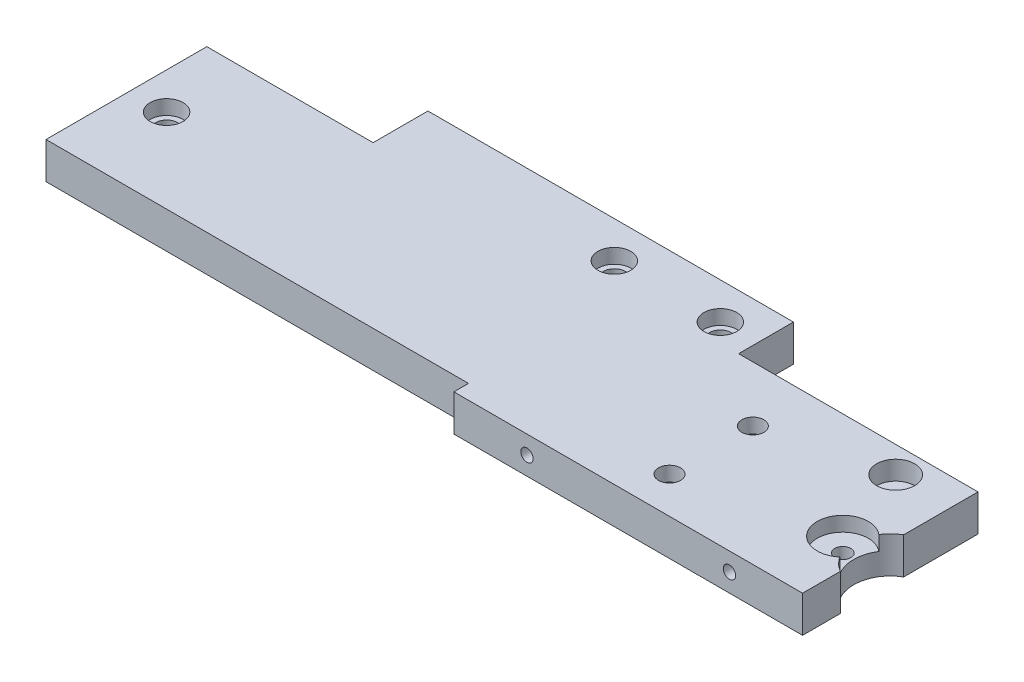
ISO-10303-21;
HEADER;
FILE_DESCRIPTION(('STEP AP214'),'2;1');
FILE_NAME('part.step','',(''),(''),'','','');
FILE_SCHEMA(('AUTOMOTIVE_DESIGN { 1 0 10303 214 1 1 1 1 }'));
ENDSEC;
DATA;
#1=APPLICATION_CONTEXT('core data for automotive mechanical design processes');
#2=APPLICATION_PROTOCOL_DEFINITION('international standard','automotive_design',2000,#1);
#3=PRODUCT_CONTEXT('',#1,'mechanical');
#4=PRODUCT('Part','Part','',(#3));
#5=PRODUCT_RELATED_PRODUCT_CATEGORY('part','',(#4));
#6=PRODUCT_DEFINITION_FORMATION('','',#4);
#7=PRODUCT_DEFINITION_CONTEXT('part definition',#1,'design');
#8=PRODUCT_DEFINITION('design','',#6,#7);
#9=PRODUCT_DEFINITION_SHAPE('','',#8);
#10=(LENGTH_UNIT() NAMED_UNIT(*) SI_UNIT(.MILLI.,.METRE.));
#11=(NAMED_UNIT(*) PLANE_ANGLE_UNIT() SI_UNIT($,.RADIAN.));
#12=(NAMED_UNIT(*) SI_UNIT($,.STERADIAN.) SOLID_ANGLE_UNIT());
#13=UNCERTAINTY_MEASURE_WITH_UNIT(LENGTH_MEASURE(1.E-05),#10,'distance_accuracy_value','');
#14=(GEOMETRIC_REPRESENTATION_CONTEXT(3) GLOBAL_UNCERTAINTY_ASSIGNED_CONTEXT((#13)) GLOBAL_UNIT_ASSIGNED_CONTEXT((#10,
#11,#12)) REPRESENTATION_CONTEXT('',''));
#15=CARTESIAN_POINT('',(0.,0.,0.));
#16=DIRECTION('',(0.,0.,1.));
#17=DIRECTION('',(1.,0.,0.));
#18=AXIS2_PLACEMENT_3D('',#15,#16,#17);
#19=CARTESIAN_POINT('',(28.75,0.,22.));
#20=DIRECTION('',(0.,1.,0.));
#21=DIRECTION('',(0.,0.,1.));
#22=AXIS2_PLACEMENT_3D('',#19,#20,#21);
#23=CYLINDRICAL_SURFACE('',#22,1.1);
#24=CARTESIAN_POINT('',(28.75,0.,22.));
#25=DIRECTION('',(0.,1.,0.));
#26=DIRECTION('',(0.,0.,1.));
#27=AXIS2_PLACEMENT_3D('',#24,#25,#26);
#28=CIRCLE('',#27,1.1);
#29=CARTESIAN_POINT('',(28.75,0.,23.1));
#30=VERTEX_POINT('',#29);
#31=EDGE_CURVE('E280',#30,#30,#28,.T.);
#32=ORIENTED_EDGE('',*,*,#31,.F.);
#33=EDGE_LOOP('',(#32));
#34=FACE_BOUND('',#33,.T.);
#35=CARTESIAN_POINT('',(28.75,3.,22.));
#36=DIRECTION('',(0.,1.,0.));
#37=DIRECTION('',(0.,0.,1.));
#38=AXIS2_PLACEMENT_3D('',#35,#36,#37);
#39=CIRCLE('',#38,1.1);
#40=CARTESIAN_POINT('',(28.75,3.,23.1));
#41=VERTEX_POINT('',#40);
#42=EDGE_CURVE('E230',#41,#41,#39,.F.);
#43=ORIENTED_EDGE('',*,*,#42,.F.);
#44=EDGE_LOOP('',(#43));
#45=FACE_BOUND('',#44,.T.);
#46=ADVANCED_FACE('F109',(#34,#45),#23,.F.);
#47=CARTESIAN_POINT('',(32.75,5.,7.5));
#48=DIRECTION('',(1.,0.,0.));
#49=DIRECTION('',(0.,0.,-1.));
#50=AXIS2_PLACEMENT_3D('',#47,#48,#49);
#51=PLANE('',#50);
#52=DIRECTION('',(0.,0.,1.));
#53=VECTOR('',#52,1.);
#54=CARTESIAN_POINT('',(32.75,0.,7.5));
#55=LINE('',#54,#53);
#56=CARTESIAN_POINT('',(32.75,0.,26.3301270189222));
#57=VERTEX_POINT('',#56);
#58=CARTESIAN_POINT('',(32.75,0.,31.5));
#59=VERTEX_POINT('',#58);
#60=EDGE_CURVE('E326',#57,#59,#55,.T.);
#61=ORIENTED_EDGE('',*,*,#60,.F.);
#62=DIRECTION('',(0.,-1.,0.));
#63=VECTOR('',#62,1.);
#64=CARTESIAN_POINT('',(32.75,5.,26.3301270189222));
#65=LINE('',#64,#63);
#66=CARTESIAN_POINT('',(32.75,5.,26.3301270189222));
#67=VERTEX_POINT('',#66);
#68=EDGE_CURVE('E401',#57,#67,#65,.F.);
#69=ORIENTED_EDGE('',*,*,#68,.T.);
#70=DIRECTION('',(0.,0.,1.));
#71=VECTOR('',#70,1.);
#72=CARTESIAN_POINT('',(32.75,5.,7.5));
#73=LINE('',#72,#71);
#74=CARTESIAN_POINT('',(32.75,5.,31.5));
#75=VERTEX_POINT('',#74);
#76=EDGE_CURVE('E226',#67,#75,#73,.T.);
#77=ORIENTED_EDGE('',*,*,#76,.T.);
#78=DIRECTION('',(0.,1.,0.));
#79=VECTOR('',#78,1.);
#80=CARTESIAN_POINT('',(32.75,5.,31.5));
#81=LINE('',#80,#79);
#82=EDGE_CURVE('E246',#59,#75,#81,.T.);
#83=ORIENTED_EDGE('',*,*,#82,.F.);
#84=EDGE_LOOP('',(#61,#69,#77,#83));
#85=FACE_BOUND('',#84,.T.);
#86=ADVANCED_FACE('F111',(#85),#51,.T.);
#87=CARTESIAN_POINT('',(32.75,5.,7.5));
#88=VERTEX_POINT('',#87);
#89=CARTESIAN_POINT('',(32.75,5.,17.6698729810778));
#90=VERTEX_POINT('',#89);
#91=EDGE_CURVE('E374',#88,#90,#73,.T.);
#92=ORIENTED_EDGE('',*,*,#91,.T.);
#93=DIRECTION('',(0.,-1.,0.));
#94=VECTOR('',#93,1.);
#95=CARTESIAN_POINT('',(32.75,5.,17.6698729810778));
#96=LINE('',#95,#94);
#97=CARTESIAN_POINT('',(32.75,0.,17.6698729810778));
#98=VERTEX_POINT('',#97);
#99=EDGE_CURVE('E352',#90,#98,#96,.T.);
#100=ORIENTED_EDGE('',*,*,#99,.T.);
#101=CARTESIAN_POINT('',(32.75,0.,7.5));
#102=VERTEX_POINT('',#101);
#103=EDGE_CURVE('E379',#102,#98,#55,.T.);
#104=ORIENTED_EDGE('',*,*,#103,.F.);
#105=DIRECTION('',(0.,-1.,0.));
#106=VECTOR('',#105,1.);
#107=CARTESIAN_POINT('',(32.75,5.,7.5));
#108=LINE('',#107,#106);
#109=EDGE_CURVE('E365',#88,#102,#108,.T.);
#110=ORIENTED_EDGE('',*,*,#109,.F.);
#111=EDGE_LOOP('',(#92,#100,#104,#110));
#112=FACE_BOUND('',#111,.T.);
#113=ADVANCED_FACE('F415',(#112),#51,.T.);
#114=CARTESIAN_POINT('',(0.,5.,29.5));
#115=DIRECTION('',(0.,0.,-1.));
#116=DIRECTION('',(-1.,0.,0.));
#117=AXIS2_PLACEMENT_3D('',#114,#115,#116);
#118=PLANE('',#117);
#119=DIRECTION('',(0.,-1.,0.));
#120=VECTOR('',#119,1.);
#121=CARTESIAN_POINT('',(-14.951964886511,5.,29.5));
#122=LINE('',#121,#120);
#123=CARTESIAN_POINT('',(-14.951964886511,5.,29.5));
#124=VERTEX_POINT('',#123);
#125=CARTESIAN_POINT('',(-14.951964886511,0.,29.5));
#126=VERTEX_POINT('',#125);
#127=EDGE_CURVE('E237',#124,#126,#122,.T.);
#128=ORIENTED_EDGE('',*,*,#127,.F.);
#129=DIRECTION('',(1.,0.,0.));
#130=VECTOR('',#129,1.);
#131=CARTESIAN_POINT('',(0.,5.,29.5));
#132=LINE('',#131,#130);
#133=CARTESIAN_POINT('',(-72.75,5.,29.5));
#134=VERTEX_POINT('',#133);
#135=EDGE_CURVE('E330',#134,#124,#132,.T.);
#136=ORIENTED_EDGE('',*,*,#135,.F.);
#137=DIRECTION('',(0.,-1.,0.));
#138=VECTOR('',#137,1.);
#139=CARTESIAN_POINT('',(-72.75,5.,29.5));
#140=LINE('',#139,#138);
#141=CARTESIAN_POINT('',(-72.75,0.,29.5));
#142=VERTEX_POINT('',#141);
#143=EDGE_CURVE('E349',#134,#142,#140,.T.);
#144=ORIENTED_EDGE('',*,*,#143,.T.);
#145=DIRECTION('',(1.,0.,0.));
#146=VECTOR('',#145,1.);
#147=CARTESIAN_POINT('',(0.,0.,29.5));
#148=LINE('',#147,#146);
#149=EDGE_CURVE('E341',#142,#126,#148,.T.);
#150=ORIENTED_EDGE('',*,*,#149,.T.);
#151=EDGE_LOOP('',(#128,#136,#144,#150));
#152=FACE_BOUND('',#151,.T.);
#153=ADVANCED_FACE('F448',(#152),#118,.F.);
#154=CARTESIAN_POINT('',(-19.5,5.,5.));
#155=DIRECTION('',(0.,-1.,0.));
#156=DIRECTION('',(0.,0.,-1.));
#157=AXIS2_PLACEMENT_3D('',#154,#155,#156);
#158=CYLINDRICAL_SURFACE('',#157,1.5);
#159=CARTESIAN_POINT('',(-19.5,0.,5.));
#160=DIRECTION('',(0.,1.,0.));
#161=DIRECTION('',(0.,0.,1.));
#162=AXIS2_PLACEMENT_3D('',#159,#160,#161);
#163=CIRCLE('',#162,1.5);
#164=CARTESIAN_POINT('',(-19.5,0.,6.5));
#165=VERTEX_POINT('',#164);
#166=EDGE_CURVE('E319',#165,#165,#163,.T.);
#167=ORIENTED_EDGE('',*,*,#166,.F.);
#168=EDGE_LOOP('',(#167));
#169=FACE_BOUND('',#168,.T.);
#170=CARTESIAN_POINT('',(-19.5,3.,5.));
#171=DIRECTION('',(0.,1.,0.));
#172=DIRECTION('',(0.,0.,1.));
#173=AXIS2_PLACEMENT_3D('',#170,#171,#172);
#174=CIRCLE('',#173,1.5);
#175=CARTESIAN_POINT('',(-19.5,3.,6.5));
#176=VERTEX_POINT('',#175);
#177=EDGE_CURVE('E323',#176,#176,#174,.T.);
#178=ORIENTED_EDGE('',*,*,#177,.T.);
#179=EDGE_LOOP('',(#178));
#180=FACE_BOUND('',#179,.T.);
#181=ADVANCED_FACE('F450',(#169,#180),#158,.F.);
#182=CARTESIAN_POINT('',(-5.,5.,5.));
#183=DIRECTION('',(0.,-1.,0.));
#184=DIRECTION('',(0.,0.,-1.));
#185=AXIS2_PLACEMENT_3D('',#182,#183,#184);
#186=CYLINDRICAL_SURFACE('',#185,1.5);
#187=CARTESIAN_POINT('',(-5.,0.,5.));
#188=DIRECTION('',(0.,1.,0.));
#189=DIRECTION('',(0.,0.,1.));
#190=AXIS2_PLACEMENT_3D('',#187,#188,#189);
#191=CIRCLE('',#190,1.5);
#192=CARTESIAN_POINT('',(-5.,0.,6.5));
#193=VERTEX_POINT('',#192);
#194=EDGE_CURVE('E316',#193,#193,#191,.T.);
#195=ORIENTED_EDGE('',*,*,#194,.F.);
#196=EDGE_LOOP('',(#195));
#197=FACE_BOUND('',#196,.T.);
#198=CARTESIAN_POINT('',(-5.,3.,5.));
#199=DIRECTION('',(0.,1.,0.));
#200=DIRECTION('',(0.,0.,1.));
#201=AXIS2_PLACEMENT_3D('',#198,#199,#200);
#202=CIRCLE('',#201,1.5);
#203=CARTESIAN_POINT('',(-5.,3.,6.5));
#204=VERTEX_POINT('',#203);
#205=EDGE_CURVE('E389',#204,#204,#202,.T.);
#206=ORIENTED_EDGE('',*,*,#205,.T.);
#207=EDGE_LOOP('',(#206));
#208=FACE_BOUND('',#207,.T.);
#209=ADVANCED_FACE('F456',(#197,#208),#186,.F.);
#210=CARTESIAN_POINT('',(-67.75,5.,18.));
#211=DIRECTION('',(0.,-1.,0.));
#212=DIRECTION('',(0.,0.,-1.));
#213=AXIS2_PLACEMENT_3D('',#210,#211,#212);
#214=CYLINDRICAL_SURFACE('',#213,1.5);
#215=CARTESIAN_POINT('',(-67.75,0.,18.));
#216=DIRECTION('',(0.,1.,0.));
#217=DIRECTION('',(0.,0.,1.));
#218=AXIS2_PLACEMENT_3D('',#215,#216,#217);
#219=CIRCLE('',#218,1.5);
#220=CARTESIAN_POINT('',(-67.75,0.,19.5));
#221=VERTEX_POINT('',#220);
#222=EDGE_CURVE('E320',#221,#221,#219,.T.);
#223=ORIENTED_EDGE('',*,*,#222,.F.);
#224=EDGE_LOOP('',(#223));
#225=FACE_BOUND('',#224,.T.);
#226=CARTESIAN_POINT('',(-67.75,3.,18.));
#227=DIRECTION('',(0.,1.,0.));
#228=DIRECTION('',(0.,0.,1.));
#229=AXIS2_PLACEMENT_3D('',#226,#227,#228);
#230=CIRCLE('',#229,1.5);
#231=CARTESIAN_POINT('',(-67.75,3.,19.5));
#232=VERTEX_POINT('',#231);
#233=EDGE_CURVE('E313',#232,#232,#230,.T.);
#234=ORIENTED_EDGE('',*,*,#233,.T.);
#235=EDGE_LOOP('',(#234));
#236=FACE_BOUND('',#235,.T.);
#237=ADVANCED_FACE('F508',(#225,#236),#214,.F.);
#238=CARTESIAN_POINT('',(0.,0.,0.));
#239=DIRECTION('',(0.,1.,0.));
#240=DIRECTION('',(0.,0.,1.));
#241=AXIS2_PLACEMENT_3D('',#238,#239,#240);
#242=PLANE('',#241);
#243=CARTESIAN_POINT('',(35.25,0.,22.));
#244=DIRECTION('',(0.,1.,0.));
#245=DIRECTION('',(0.,0.,1.));
#246=AXIS2_PLACEMENT_3D('',#243,#244,#245);
#247=CIRCLE('',#246,5.);
#248=EDGE_CURVE('E131',#98,#57,#247,.T.);
#249=ORIENTED_EDGE('',*,*,#248,.T.);
#250=ORIENTED_EDGE('',*,*,#60,.T.);
#251=DIRECTION('',(1.,0.,0.));
#252=VECTOR('',#251,1.);
#253=CARTESIAN_POINT('',(32.75,0.,31.5));
#254=LINE('',#253,#252);
#255=CARTESIAN_POINT('',(-14.951964886511,0.,31.5));
#256=VERTEX_POINT('',#255);
#257=EDGE_CURVE('E253',#256,#59,#254,.T.);
#258=ORIENTED_EDGE('',*,*,#257,.F.);
#259=DIRECTION('',(0.,0.,-1.));
#260=VECTOR('',#259,1.);
#261=CARTESIAN_POINT('',(-14.951964886511,0.,31.5));
#262=LINE('',#261,#260);
#263=EDGE_CURVE('E256',#256,#126,#262,.T.);
#264=ORIENTED_EDGE('',*,*,#263,.T.);
#265=ORIENTED_EDGE('',*,*,#149,.F.);
#266=DIRECTION('',(0.,0.,1.));
#267=VECTOR('',#266,1.);
#268=CARTESIAN_POINT('',(-72.75,0.,0.));
#269=LINE('',#268,#267);
#270=CARTESIAN_POINT('',(-72.75,0.,7.5));
#271=VERTEX_POINT('',#270);
#272=EDGE_CURVE('E338',#271,#142,#269,.T.);
#273=ORIENTED_EDGE('',*,*,#272,.F.);
#274=DIRECTION('',(1.,0.,0.));
#275=VECTOR('',#274,1.);
#276=CARTESIAN_POINT('',(0.,0.,7.5));
#277=LINE('',#276,#275);
#278=CARTESIAN_POINT('',(-50.,0.,7.5));
#279=VERTEX_POINT('',#278);
#280=EDGE_CURVE('E331',#271,#279,#277,.T.);
#281=ORIENTED_EDGE('',*,*,#280,.T.);
#282=DIRECTION('',(0.,0.,-1.));
#283=VECTOR('',#282,1.);
#284=CARTESIAN_POINT('',(-50.,0.,29.5));
#285=LINE('',#284,#283);
#286=CARTESIAN_POINT('',(-50.,0.,0.));
#287=VERTEX_POINT('',#286);
#288=EDGE_CURVE('E362',#279,#287,#285,.T.);
#289=ORIENTED_EDGE('',*,*,#288,.T.);
#290=DIRECTION('',(1.,0.,0.));
#291=VECTOR('',#290,1.);
#292=CARTESIAN_POINT('',(-50.,0.,0.));
#293=LINE('',#292,#291);
#294=CARTESIAN_POINT('',(0.,0.,0.));
#295=VERTEX_POINT('',#294);
#296=EDGE_CURVE('E364',#287,#295,#293,.T.);
#297=ORIENTED_EDGE('',*,*,#296,.T.);
#298=DIRECTION('',(0.,0.,-1.));
#299=VECTOR('',#298,1.);
#300=CARTESIAN_POINT('',(0.,0.,29.5));
#301=LINE('',#300,#299);
#302=CARTESIAN_POINT('',(0.,0.,7.5));
#303=VERTEX_POINT('',#302);
#304=EDGE_CURVE('E356',#303,#295,#301,.T.);
#305=ORIENTED_EDGE('',*,*,#304,.F.);
#306=DIRECTION('',(1.,0.,0.));
#307=VECTOR('',#306,1.);
#308=CARTESIAN_POINT('',(-72.75,0.,7.5));
#309=LINE('',#308,#307);
#310=EDGE_CURVE('E382',#303,#102,#309,.T.);
#311=ORIENTED_EDGE('',*,*,#310,.T.);
#312=ORIENTED_EDGE('',*,*,#103,.T.);
#313=EDGE_LOOP('',(#249,#250,#258,#264,#265,#273,#281,#289,#297,#305,#311,#312));
#314=FACE_BOUND('',#313,.T.);
#315=CARTESIAN_POINT('',(9.54803511348903,0.,26.5000000000005));
#316=DIRECTION('',(0.,-1.,0.));
#317=DIRECTION('',(0.,0.,-1.));
#318=AXIS2_PLACEMENT_3D('',#315,#316,#317);
#319=CIRCLE('',#318,2.25);
#320=CARTESIAN_POINT('',(9.54803511348903,0.,24.2500000000005));
#321=VERTEX_POINT('',#320);
#322=EDGE_CURVE('E265',#321,#321,#319,.T.);
#323=ORIENTED_EDGE('',*,*,#322,.F.);
#324=EDGE_LOOP('',(#323));
#325=FACE_BOUND('',#324,.T.);
#326=CARTESIAN_POINT('',(9.54803511348903,0.,15.1000000000005));
#327=DIRECTION('',(0.,-1.,0.));
#328=DIRECTION('',(0.,0.,-1.));
#329=AXIS2_PLACEMENT_3D('',#326,#327,#328);
#330=CIRCLE('',#329,2.25);
#331=CARTESIAN_POINT('',(9.54803511348903,0.,12.8500000000005));
#332=VERTEX_POINT('',#331);
#333=EDGE_CURVE('E269',#332,#332,#330,.T.);
#334=ORIENTED_EDGE('',*,*,#333,.F.);
#335=EDGE_LOOP('',(#334));
#336=FACE_BOUND('',#335,.T.);
#337=CARTESIAN_POINT('',(25.0839394440354,0.,11.1));
#338=DIRECTION('',(0.,1.,0.));
#339=DIRECTION('',(0.,0.,1.));
#340=AXIS2_PLACEMENT_3D('',#337,#338,#339);
#341=CIRCLE('',#340,1.1);
#342=CARTESIAN_POINT('',(25.0839394440354,0.,12.2));
#343=VERTEX_POINT('',#342);
#344=EDGE_CURVE('E285',#343,#343,#341,.T.);
#345=ORIENTED_EDGE('',*,*,#344,.T.);
#346=EDGE_LOOP('',(#345));
#347=FACE_BOUND('',#346,.T.);
#348=ORIENTED_EDGE('',*,*,#31,.T.);
#349=EDGE_LOOP('',(#348));
#350=FACE_BOUND('',#349,.T.);
#351=ORIENTED_EDGE('',*,*,#222,.T.);
#352=EDGE_LOOP('',(#351));
#353=FACE_BOUND('',#352,.T.);
#354=ORIENTED_EDGE('',*,*,#194,.T.);
#355=EDGE_LOOP('',(#354));
#356=FACE_BOUND('',#355,.T.);
#357=ORIENTED_EDGE('',*,*,#166,.T.);
#358=EDGE_LOOP('',(#357));
#359=FACE_BOUND('',#358,.T.);
#360=ADVANCED_FACE('F407',(#314,#325,#336,#347,#350,#353,#356,#359),#242,.F.);
#361=CARTESIAN_POINT('',(0.,5.,7.5));
#362=DIRECTION('',(0.,0.,-1.));
#363=DIRECTION('',(-1.,0.,0.));
#364=AXIS2_PLACEMENT_3D('',#361,#362,#363);
#365=PLANE('',#364);
#366=ORIENTED_EDGE('',*,*,#280,.F.);
#367=DIRECTION('',(0.,-1.,0.));
#368=VECTOR('',#367,1.);
#369=CARTESIAN_POINT('',(-72.75,5.,7.5));
#370=LINE('',#369,#368);
#371=CARTESIAN_POINT('',(-72.75,5.,7.5));
#372=VERTEX_POINT('',#371);
#373=EDGE_CURVE('E337',#372,#271,#370,.T.);
#374=ORIENTED_EDGE('',*,*,#373,.F.);
#375=DIRECTION('',(1.,0.,0.));
#376=VECTOR('',#375,1.);
#377=CARTESIAN_POINT('',(0.,5.,7.5));
#378=LINE('',#377,#376);
#379=CARTESIAN_POINT('',(-50.,5.,7.5));
#380=VERTEX_POINT('',#379);
#381=EDGE_CURVE('E334',#372,#380,#378,.T.);
#382=ORIENTED_EDGE('',*,*,#381,.T.);
#383=DIRECTION('',(0.,-1.,0.));
#384=VECTOR('',#383,1.);
#385=CARTESIAN_POINT('',(-50.,5.,7.5));
#386=LINE('',#385,#384);
#387=EDGE_CURVE('E347',#380,#279,#386,.T.);
#388=ORIENTED_EDGE('',*,*,#387,.T.);
#389=EDGE_LOOP('',(#366,#374,#382,#388));
#390=FACE_BOUND('',#389,.T.);
#391=ADVANCED_FACE('F433',(#390),#365,.T.);
#392=CARTESIAN_POINT('',(-72.75,5.,0.));
#393=DIRECTION('',(1.,0.,0.));
#394=DIRECTION('',(0.,0.,-1.));
#395=AXIS2_PLACEMENT_3D('',#392,#393,#394);
#396=PLANE('',#395);
#397=ORIENTED_EDGE('',*,*,#272,.T.);
#398=ORIENTED_EDGE('',*,*,#143,.F.);
#399=DIRECTION('',(0.,0.,1.));
#400=VECTOR('',#399,1.);
#401=CARTESIAN_POINT('',(-72.75,5.,0.));
#402=LINE('',#401,#400);
#403=EDGE_CURVE('E327',#372,#134,#402,.T.);
#404=ORIENTED_EDGE('',*,*,#403,.F.);
#405=ORIENTED_EDGE('',*,*,#373,.T.);
#406=EDGE_LOOP('',(#397,#398,#404,#405));
#407=FACE_BOUND('',#406,.T.);
#408=ADVANCED_FACE('F439',(#407),#396,.F.);
#409=CARTESIAN_POINT('',(0.,5.,0.));
#410=DIRECTION('',(0.,1.,0.));
#411=DIRECTION('',(0.,0.,1.));
#412=AXIS2_PLACEMENT_3D('',#409,#410,#411);
#413=PLANE('',#412);
#414=CARTESIAN_POINT('',(28.75,5.,22.));
#415=DIRECTION('',(0.,1.,0.));
#416=DIRECTION('',(0.,0.,1.));
#417=AXIS2_PLACEMENT_3D('',#414,#415,#416);
#418=CIRCLE('',#417,3.5);
#419=CARTESIAN_POINT('',(31.0192307692308,5.,19.335306449894));
#420=VERTEX_POINT('',#419);
#421=CARTESIAN_POINT('',(31.0192307692308,5.,24.664693550106));
#422=VERTEX_POINT('',#421);
#423=EDGE_CURVE('E208',#420,#422,#418,.T.);
#424=ORIENTED_EDGE('',*,*,#423,.F.);
#425=CARTESIAN_POINT('',(35.25,5.,22.));
#426=DIRECTION('',(0.,1.,0.));
#427=DIRECTION('',(0.,0.,1.));
#428=AXIS2_PLACEMENT_3D('',#425,#426,#427);
#429=CIRCLE('',#428,5.);
#430=EDGE_CURVE('E227',#90,#420,#429,.T.);
#431=ORIENTED_EDGE('',*,*,#430,.F.);
#432=ORIENTED_EDGE('',*,*,#91,.F.);
#433=DIRECTION('',(1.,0.,0.));
#434=VECTOR('',#433,1.);
#435=CARTESIAN_POINT('',(-72.75,5.,7.5));
#436=LINE('',#435,#434);
#437=CARTESIAN_POINT('',(0.,5.,7.5));
#438=VERTEX_POINT('',#437);
#439=EDGE_CURVE('E377',#438,#88,#436,.T.);
#440=ORIENTED_EDGE('',*,*,#439,.F.);
#441=DIRECTION('',(0.,0.,-1.));
#442=VECTOR('',#441,1.);
#443=CARTESIAN_POINT('',(0.,5.,29.5));
#444=LINE('',#443,#442);
#445=CARTESIAN_POINT('',(0.,5.,0.));
#446=VERTEX_POINT('',#445);
#447=EDGE_CURVE('E359',#438,#446,#444,.T.);
#448=ORIENTED_EDGE('',*,*,#447,.T.);
#449=DIRECTION('',(1.,0.,0.));
#450=VECTOR('',#449,1.);
#451=CARTESIAN_POINT('',(-50.,5.,0.));
#452=LINE('',#451,#450);
#453=CARTESIAN_POINT('',(-50.,5.,0.));
#454=VERTEX_POINT('',#453);
#455=EDGE_CURVE('E355',#454,#446,#452,.T.);
#456=ORIENTED_EDGE('',*,*,#455,.F.);
#457=DIRECTION('',(0.,0.,-1.));
#458=VECTOR('',#457,1.);
#459=CARTESIAN_POINT('',(-50.,5.,29.5));
#460=LINE('',#459,#458);
#461=EDGE_CURVE('E353',#380,#454,#460,.T.);
#462=ORIENTED_EDGE('',*,*,#461,.F.);
#463=ORIENTED_EDGE('',*,*,#381,.F.);
#464=ORIENTED_EDGE('',*,*,#403,.T.);
#465=ORIENTED_EDGE('',*,*,#135,.T.);
#466=DIRECTION('',(0.,0.,-1.));
#467=VECTOR('',#466,1.);
#468=CARTESIAN_POINT('',(-14.951964886511,5.,31.5));
#469=LINE('',#468,#467);
#470=CARTESIAN_POINT('',(-14.951964886511,5.,31.5));
#471=VERTEX_POINT('',#470);
#472=EDGE_CURVE('E261',#471,#124,#469,.T.);
#473=ORIENTED_EDGE('',*,*,#472,.F.);
#474=DIRECTION('',(-1.,0.,0.));
#475=VECTOR('',#474,1.);
#476=CARTESIAN_POINT('',(32.75,5.,31.5));
#477=LINE('',#476,#475);
#478=EDGE_CURVE('E249',#75,#471,#477,.T.);
#479=ORIENTED_EDGE('',*,*,#478,.F.);
#480=ORIENTED_EDGE('',*,*,#76,.F.);
#481=EDGE_CURVE('E219',#422,#67,#429,.T.);
#482=ORIENTED_EDGE('',*,*,#481,.F.);
#483=EDGE_LOOP('',(#424,#431,#432,#440,#448,#456,#462,#463,#464,#465,#473,#479,#480,#482));
#484=FACE_BOUND('',#483,.T.);
#485=CARTESIAN_POINT('',(9.54803511348903,5.,15.1000000000005));
#486=DIRECTION('',(0.,-1.,0.));
#487=DIRECTION('',(0.,0.,-1.));
#488=AXIS2_PLACEMENT_3D('',#485,#486,#487);
#489=CIRCLE('',#488,1.5);
#490=CARTESIAN_POINT('',(9.54803511348903,5.,13.6000000000005));
#491=VERTEX_POINT('',#490);
#492=EDGE_CURVE('E277',#491,#491,#489,.T.);
#493=ORIENTED_EDGE('',*,*,#492,.T.);
#494=EDGE_LOOP('',(#493));
#495=FACE_BOUND('',#494,.T.);
#496=CARTESIAN_POINT('',(9.54803511348903,5.,26.5000000000005));
#497=DIRECTION('',(0.,-1.,0.));
#498=DIRECTION('',(0.,0.,-1.));
#499=AXIS2_PLACEMENT_3D('',#496,#497,#498);
#500=CIRCLE('',#499,1.5);
#501=CARTESIAN_POINT('',(9.54803511348903,5.,25.0000000000005));
#502=VERTEX_POINT('',#501);
#503=EDGE_CURVE('E281',#502,#502,#500,.T.);
#504=ORIENTED_EDGE('',*,*,#503,.T.);
#505=EDGE_LOOP('',(#504));
#506=FACE_BOUND('',#505,.T.);
#507=CARTESIAN_POINT('',(25.0839394440354,5.,11.1));
#508=DIRECTION('',(0.,1.,0.));
#509=DIRECTION('',(0.,0.,1.));
#510=AXIS2_PLACEMENT_3D('',#507,#508,#509);
#511=CIRCLE('',#510,2.6);
#512=CARTESIAN_POINT('',(25.0839394440354,5.,13.7));
#513=VERTEX_POINT('',#512);
#514=EDGE_CURVE('E295',#513,#513,#511,.T.);
#515=ORIENTED_EDGE('',*,*,#514,.F.);
#516=EDGE_LOOP('',(#515));
#517=FACE_BOUND('',#516,.T.);
#518=CARTESIAN_POINT('',(-67.75,5.,18.));
#519=DIRECTION('',(0.,1.,0.));
#520=DIRECTION('',(0.,0.,1.));
#521=AXIS2_PLACEMENT_3D('',#518,#519,#520);
#522=CIRCLE('',#521,2.25);
#523=CARTESIAN_POINT('',(-67.75,5.,20.25));
#524=VERTEX_POINT('',#523);
#525=EDGE_CURVE('E305',#524,#524,#522,.T.);
#526=ORIENTED_EDGE('',*,*,#525,.F.);
#527=EDGE_LOOP('',(#526));
#528=FACE_BOUND('',#527,.T.);
#529=CARTESIAN_POINT('',(-5.,5.,5.));
#530=DIRECTION('',(0.,1.,0.));
#531=DIRECTION('',(0.,0.,1.));
#532=AXIS2_PLACEMENT_3D('',#529,#530,#531);
#533=CIRCLE('',#532,2.25);
#534=CARTESIAN_POINT('',(-5.,5.,7.25));
#535=VERTEX_POINT('',#534);
#536=EDGE_CURVE('E298',#535,#535,#533,.T.);
#537=ORIENTED_EDGE('',*,*,#536,.F.);
#538=EDGE_LOOP('',(#537));
#539=FACE_BOUND('',#538,.T.);
#540=CARTESIAN_POINT('',(-19.5,5.,5.));
#541=DIRECTION('',(0.,1.,0.));
#542=DIRECTION('',(0.,0.,1.));
#543=AXIS2_PLACEMENT_3D('',#540,#541,#542);
#544=CIRCLE('',#543,2.25);
#545=CARTESIAN_POINT('',(-19.5,5.,7.25));
#546=VERTEX_POINT('',#545);
#547=EDGE_CURVE('E301',#546,#546,#544,.T.);
#548=ORIENTED_EDGE('',*,*,#547,.F.);
#549=EDGE_LOOP('',(#548));
#550=FACE_BOUND('',#549,.T.);
#551=ADVANCED_FACE('F223',(#484,#495,#506,#517,#528,#539,#550),#413,.T.);
#552=CARTESIAN_POINT('',(-72.75,5.,7.5));
#553=DIRECTION('',(0.,0.,-1.));
#554=DIRECTION('',(-1.,0.,0.));
#555=AXIS2_PLACEMENT_3D('',#552,#553,#554);
#556=PLANE('',#555);
#557=DIRECTION('',(0.,-1.,0.));
#558=VECTOR('',#557,1.);
#559=CARTESIAN_POINT('',(0.,5.,7.5));
#560=LINE('',#559,#558);
#561=EDGE_CURVE('E342',#438,#303,#560,.T.);
#562=ORIENTED_EDGE('',*,*,#561,.F.);
#563=ORIENTED_EDGE('',*,*,#439,.T.);
#564=ORIENTED_EDGE('',*,*,#109,.T.);
#565=ORIENTED_EDGE('',*,*,#310,.F.);
#566=EDGE_LOOP('',(#562,#563,#564,#565));
#567=FACE_BOUND('',#566,.T.);
#568=ADVANCED_FACE('F515',(#567),#556,.T.);
#569=CARTESIAN_POINT('',(0.,5.,29.5));
#570=DIRECTION('',(-1.,0.,0.));
#571=DIRECTION('',(0.,0.,1.));
#572=AXIS2_PLACEMENT_3D('',#569,#570,#571);
#573=PLANE('',#572);
#574=ORIENTED_EDGE('',*,*,#447,.F.);
#575=ORIENTED_EDGE('',*,*,#561,.T.);
#576=ORIENTED_EDGE('',*,*,#304,.T.);
#577=DIRECTION('',(0.,-1.,0.));
#578=VECTOR('',#577,1.);
#579=CARTESIAN_POINT('',(0.,5.,0.));
#580=LINE('',#579,#578);
#581=EDGE_CURVE('E369',#446,#295,#580,.T.);
#582=ORIENTED_EDGE('',*,*,#581,.F.);
#583=EDGE_LOOP('',(#574,#575,#576,#582));
#584=FACE_BOUND('',#583,.T.);
#585=ADVANCED_FACE('F423',(#584),#573,.F.);
#586=CARTESIAN_POINT('',(-50.,5.,0.));
#587=DIRECTION('',(0.,0.,-1.));
#588=DIRECTION('',(-1.,0.,0.));
#589=AXIS2_PLACEMENT_3D('',#586,#587,#588);
#590=PLANE('',#589);
#591=ORIENTED_EDGE('',*,*,#296,.F.);
#592=DIRECTION('',(0.,-1.,0.));
#593=VECTOR('',#592,1.);
#594=CARTESIAN_POINT('',(-50.,5.,0.));
#595=LINE('',#594,#593);
#596=EDGE_CURVE('E361',#454,#287,#595,.T.);
#597=ORIENTED_EDGE('',*,*,#596,.F.);
#598=ORIENTED_EDGE('',*,*,#455,.T.);
#599=ORIENTED_EDGE('',*,*,#581,.T.);
#600=EDGE_LOOP('',(#591,#597,#598,#599));
#601=FACE_BOUND('',#600,.T.);
#602=ADVANCED_FACE('F427',(#601),#590,.T.);
#603=CARTESIAN_POINT('',(-50.,5.,29.5));
#604=DIRECTION('',(-1.,0.,0.));
#605=DIRECTION('',(0.,0.,1.));
#606=AXIS2_PLACEMENT_3D('',#603,#604,#605);
#607=PLANE('',#606);
#608=ORIENTED_EDGE('',*,*,#387,.F.);
#609=ORIENTED_EDGE('',*,*,#461,.T.);
#610=ORIENTED_EDGE('',*,*,#596,.T.);
#611=ORIENTED_EDGE('',*,*,#288,.F.);
#612=EDGE_LOOP('',(#608,#609,#610,#611));
#613=FACE_BOUND('',#612,.T.);
#614=ADVANCED_FACE('F495',(#613),#607,.T.);
#615=CARTESIAN_POINT('',(-67.75,3.,18.));
#616=DIRECTION('',(0.,1.,0.));
#617=DIRECTION('',(0.,0.,1.));
#618=AXIS2_PLACEMENT_3D('',#615,#616,#617);
#619=CYLINDRICAL_SURFACE('',#618,2.25);
#620=CARTESIAN_POINT('',(-67.75,3.,18.));
#621=DIRECTION('',(0.,1.,0.));
#622=DIRECTION('',(0.,0.,1.));
#623=AXIS2_PLACEMENT_3D('',#620,#621,#622);
#624=CIRCLE('',#623,2.25);
#625=CARTESIAN_POINT('',(-67.75,3.,20.25));
#626=VERTEX_POINT('',#625);
#627=EDGE_CURVE('E294',#626,#626,#624,.T.);
#628=ORIENTED_EDGE('',*,*,#627,.F.);
#629=EDGE_LOOP('',(#628));
#630=FACE_BOUND('',#629,.T.);
#631=ORIENTED_EDGE('',*,*,#525,.T.);
#632=EDGE_LOOP('',(#631));
#633=FACE_BOUND('',#632,.T.);
#634=ADVANCED_FACE('F492',(#630,#633),#619,.F.);
#635=CARTESIAN_POINT('',(-67.75,3.,18.));
#636=DIRECTION('',(0.,1.,0.));
#637=DIRECTION('',(0.,0.,1.));
#638=AXIS2_PLACEMENT_3D('',#635,#636,#637);
#639=PLANE('',#638);
#640=ORIENTED_EDGE('',*,*,#233,.F.);
#641=EDGE_LOOP('',(#640));
#642=FACE_BOUND('',#641,.T.);
#643=ORIENTED_EDGE('',*,*,#627,.T.);
#644=EDGE_LOOP('',(#643));
#645=FACE_BOUND('',#644,.T.);
#646=ADVANCED_FACE('F486',(#642,#645),#639,.T.);
#647=CARTESIAN_POINT('',(-5.,3.,5.));
#648=DIRECTION('',(0.,1.,0.));
#649=DIRECTION('',(0.,0.,1.));
#650=AXIS2_PLACEMENT_3D('',#647,#648,#649);
#651=CYLINDRICAL_SURFACE('',#650,2.25);
#652=CARTESIAN_POINT('',(-5.,3.,5.));
#653=DIRECTION('',(0.,1.,0.));
#654=DIRECTION('',(0.,0.,1.));
#655=AXIS2_PLACEMENT_3D('',#652,#653,#654);
#656=CIRCLE('',#655,2.25);
#657=CARTESIAN_POINT('',(-5.,3.,7.25));
#658=VERTEX_POINT('',#657);
#659=EDGE_CURVE('E302',#658,#658,#656,.T.);
#660=ORIENTED_EDGE('',*,*,#659,.F.);
#661=EDGE_LOOP('',(#660));
#662=FACE_BOUND('',#661,.T.);
#663=ORIENTED_EDGE('',*,*,#536,.T.);
#664=EDGE_LOOP('',(#663));
#665=FACE_BOUND('',#664,.T.);
#666=ADVANCED_FACE('F482',(#662,#665),#651,.F.);
#667=CARTESIAN_POINT('',(-5.,3.,5.));
#668=DIRECTION('',(0.,1.,0.));
#669=DIRECTION('',(0.,0.,1.));
#670=AXIS2_PLACEMENT_3D('',#667,#668,#669);
#671=PLANE('',#670);
#672=ORIENTED_EDGE('',*,*,#205,.F.);
#673=EDGE_LOOP('',(#672));
#674=FACE_BOUND('',#673,.T.);
#675=ORIENTED_EDGE('',*,*,#659,.T.);
#676=EDGE_LOOP('',(#675));
#677=FACE_BOUND('',#676,.T.);
#678=ADVANCED_FACE('F485',(#674,#677),#671,.T.);
#679=CARTESIAN_POINT('',(-19.5,3.,5.));
#680=DIRECTION('',(0.,1.,0.));
#681=DIRECTION('',(0.,0.,1.));
#682=AXIS2_PLACEMENT_3D('',#679,#680,#681);
#683=CYLINDRICAL_SURFACE('',#682,2.25);
#684=CARTESIAN_POINT('',(-19.5,3.,5.));
#685=DIRECTION('',(0.,1.,0.));
#686=DIRECTION('',(0.,0.,1.));
#687=AXIS2_PLACEMENT_3D('',#684,#685,#686);
#688=CIRCLE('',#687,2.25);
#689=CARTESIAN_POINT('',(-19.5,3.,7.25));
#690=VERTEX_POINT('',#689);
#691=EDGE_CURVE('E310',#690,#690,#688,.T.);
#692=ORIENTED_EDGE('',*,*,#691,.F.);
#693=EDGE_LOOP('',(#692));
#694=FACE_BOUND('',#693,.T.);
#695=ORIENTED_EDGE('',*,*,#547,.T.);
#696=EDGE_LOOP('',(#695));
#697=FACE_BOUND('',#696,.T.);
#698=ADVANCED_FACE('F490',(#694,#697),#683,.F.);
#699=CARTESIAN_POINT('',(-19.5,3.,5.));
#700=DIRECTION('',(0.,1.,0.));
#701=DIRECTION('',(0.,0.,1.));
#702=AXIS2_PLACEMENT_3D('',#699,#700,#701);
#703=PLANE('',#702);
#704=ORIENTED_EDGE('',*,*,#177,.F.);
#705=EDGE_LOOP('',(#704));
#706=FACE_BOUND('',#705,.T.);
#707=ORIENTED_EDGE('',*,*,#691,.T.);
#708=EDGE_LOOP('',(#707));
#709=FACE_BOUND('',#708,.T.);
#710=ADVANCED_FACE('F480',(#706,#709),#703,.T.);
#711=CARTESIAN_POINT('',(25.0839394440354,2.4,11.1));
#712=DIRECTION('',(0.,1.,0.));
#713=DIRECTION('',(0.,0.,1.));
#714=AXIS2_PLACEMENT_3D('',#711,#712,#713);
#715=CYLINDRICAL_SURFACE('',#714,2.6);
#716=CARTESIAN_POINT('',(25.0839394440354,2.4,11.1));
#717=DIRECTION('',(0.,1.,0.));
#718=DIRECTION('',(0.,0.,1.));
#719=AXIS2_PLACEMENT_3D('',#716,#717,#718);
#720=CIRCLE('',#719,2.6);
#721=CARTESIAN_POINT('',(25.0839394440354,2.4,13.7));
#722=VERTEX_POINT('',#721);
#723=EDGE_CURVE('E291',#722,#722,#720,.T.);
#724=ORIENTED_EDGE('',*,*,#723,.F.);
#725=EDGE_LOOP('',(#724));
#726=FACE_BOUND('',#725,.T.);
#727=ORIENTED_EDGE('',*,*,#514,.T.);
#728=EDGE_LOOP('',(#727));
#729=FACE_BOUND('',#728,.T.);
#730=ADVANCED_FACE('F476',(#726,#729),#715,.F.);
#731=CARTESIAN_POINT('',(25.0839394440354,2.4,11.1));
#732=DIRECTION('',(0.,1.,0.));
#733=DIRECTION('',(0.,0.,1.));
#734=AXIS2_PLACEMENT_3D('',#731,#732,#733);
#735=PLANE('',#734);
#736=CARTESIAN_POINT('',(25.0839394440354,2.4,11.1));
#737=DIRECTION('',(0.,1.,0.));
#738=DIRECTION('',(0.,0.,1.));
#739=AXIS2_PLACEMENT_3D('',#736,#737,#738);
#740=CIRCLE('',#739,1.1);
#741=CARTESIAN_POINT('',(25.0839394440354,2.4,12.2));
#742=VERTEX_POINT('',#741);
#743=EDGE_CURVE('E288',#742,#742,#740,.T.);
#744=ORIENTED_EDGE('',*,*,#743,.F.);
#745=EDGE_LOOP('',(#744));
#746=FACE_BOUND('',#745,.T.);
#747=ORIENTED_EDGE('',*,*,#723,.T.);
#748=EDGE_LOOP('',(#747));
#749=FACE_BOUND('',#748,.T.);
#750=ADVANCED_FACE('F473',(#746,#749),#735,.T.);
#751=CARTESIAN_POINT('',(25.0839394440354,0.,11.1));
#752=DIRECTION('',(0.,1.,0.));
#753=DIRECTION('',(0.,0.,1.));
#754=AXIS2_PLACEMENT_3D('',#751,#752,#753);
#755=CYLINDRICAL_SURFACE('',#754,1.1);
#756=ORIENTED_EDGE('',*,*,#743,.T.);
#757=EDGE_LOOP('',(#756));
#758=FACE_BOUND('',#757,.T.);
#759=ORIENTED_EDGE('',*,*,#344,.F.);
#760=EDGE_LOOP('',(#759));
#761=FACE_BOUND('',#760,.T.);
#762=ADVANCED_FACE('F471',(#758,#761),#755,.F.);
#763=CARTESIAN_POINT('',(9.54803511348903,5.,26.5000000000005));
#764=DIRECTION('',(0.,-1.,0.));
#765=DIRECTION('',(0.,0.,-1.));
#766=AXIS2_PLACEMENT_3D('',#763,#764,#765);
#767=CYLINDRICAL_SURFACE('',#766,1.5);
#768=CARTESIAN_POINT('',(9.54803511348903,3.,26.5000000000005));
#769=DIRECTION('',(0.,1.,0.));
#770=DIRECTION('',(0.,0.,1.));
#771=AXIS2_PLACEMENT_3D('',#768,#769,#770);
#772=CIRCLE('',#771,1.5);
#773=CARTESIAN_POINT('',(9.54803511348903,3.,28.0000000000005));
#774=VERTEX_POINT('',#773);
#775=EDGE_CURVE('E284',#774,#774,#772,.F.);
#776=ORIENTED_EDGE('',*,*,#775,.T.);
#777=EDGE_LOOP('',(#776));
#778=FACE_BOUND('',#777,.T.);
#779=ORIENTED_EDGE('',*,*,#503,.F.);
#780=EDGE_LOOP('',(#779));
#781=FACE_BOUND('',#780,.T.);
#782=ADVANCED_FACE('F617',(#778,#781),#767,.F.);
#783=CARTESIAN_POINT('',(9.54803511348903,5.,15.1000000000005));
#784=DIRECTION('',(0.,-1.,0.));
#785=DIRECTION('',(0.,0.,-1.));
#786=AXIS2_PLACEMENT_3D('',#783,#784,#785);
#787=CYLINDRICAL_SURFACE('',#786,1.5);
#788=CARTESIAN_POINT('',(9.54803511348903,3.,15.1000000000005));
#789=DIRECTION('',(0.,1.,0.));
#790=DIRECTION('',(0.,0.,1.));
#791=AXIS2_PLACEMENT_3D('',#788,#789,#790);
#792=CIRCLE('',#791,1.5);
#793=CARTESIAN_POINT('',(9.54803511348903,3.,16.6000000000005));
#794=VERTEX_POINT('',#793);
#795=EDGE_CURVE('E272',#794,#794,#792,.F.);
#796=ORIENTED_EDGE('',*,*,#795,.T.);
#797=EDGE_LOOP('',(#796));
#798=FACE_BOUND('',#797,.T.);
#799=ORIENTED_EDGE('',*,*,#492,.F.);
#800=EDGE_LOOP('',(#799));
#801=FACE_BOUND('',#800,.T.);
#802=ADVANCED_FACE('F626',(#798,#801),#787,.F.);
#803=CARTESIAN_POINT('',(0.,3.,0.));
#804=DIRECTION('',(0.,1.,0.));
#805=DIRECTION('',(0.,0.,1.));
#806=AXIS2_PLACEMENT_3D('',#803,#804,#805);
#807=PLANE('',#806);
#808=CARTESIAN_POINT('',(9.54803511348903,3.,15.1000000000005));
#809=DIRECTION('',(0.,1.,0.));
#810=DIRECTION('',(0.,0.,1.));
#811=AXIS2_PLACEMENT_3D('',#808,#809,#810);
#812=CIRCLE('',#811,2.25);
#813=CARTESIAN_POINT('',(9.54803511348903,3.,17.3500000000005));
#814=VERTEX_POINT('',#813);
#815=EDGE_CURVE('E264',#814,#814,#812,.F.);
#816=ORIENTED_EDGE('',*,*,#815,.T.);
#817=EDGE_LOOP('',(#816));
#818=FACE_BOUND('',#817,.T.);
#819=ORIENTED_EDGE('',*,*,#795,.F.);
#820=EDGE_LOOP('',(#819));
#821=FACE_BOUND('',#820,.T.);
#822=ADVANCED_FACE('F635',(#818,#821),#807,.F.);
#823=CARTESIAN_POINT('',(9.54803511348903,11.3639610306789,15.1000000000005));
#824=DIRECTION('',(0.,-1.,0.));
#825=DIRECTION('',(0.,0.,-1.));
#826=AXIS2_PLACEMENT_3D('',#823,#824,#825);
#827=CYLINDRICAL_SURFACE('',#826,2.25);
#828=ORIENTED_EDGE('',*,*,#333,.T.);
#829=EDGE_LOOP('',(#828));
#830=FACE_BOUND('',#829,.T.);
#831=ORIENTED_EDGE('',*,*,#815,.F.);
#832=EDGE_LOOP('',(#831));
#833=FACE_BOUND('',#832,.T.);
#834=ADVANCED_FACE('F645',(#830,#833),#827,.F.);
#835=CARTESIAN_POINT('',(0.,3.,0.));
#836=DIRECTION('',(0.,1.,0.));
#837=DIRECTION('',(0.,0.,1.));
#838=AXIS2_PLACEMENT_3D('',#835,#836,#837);
#839=PLANE('',#838);
#840=CARTESIAN_POINT('',(9.54803511348903,3.,26.5000000000005));
#841=DIRECTION('',(0.,1.,0.));
#842=DIRECTION('',(0.,0.,1.));
#843=AXIS2_PLACEMENT_3D('',#840,#841,#842);
#844=CIRCLE('',#843,2.25);
#845=CARTESIAN_POINT('',(9.54803511348903,3.,28.7500000000005));
#846=VERTEX_POINT('',#845);
#847=EDGE_CURVE('E268',#846,#846,#844,.F.);
#848=ORIENTED_EDGE('',*,*,#847,.T.);
#849=EDGE_LOOP('',(#848));
#850=FACE_BOUND('',#849,.T.);
#851=ORIENTED_EDGE('',*,*,#775,.F.);
#852=EDGE_LOOP('',(#851));
#853=FACE_BOUND('',#852,.T.);
#854=ADVANCED_FACE('F655',(#850,#853),#839,.F.);
#855=CARTESIAN_POINT('',(9.54803511348903,11.3639610306789,26.5000000000005));
#856=DIRECTION('',(0.,-1.,0.));
#857=DIRECTION('',(0.,0.,-1.));
#858=AXIS2_PLACEMENT_3D('',#855,#856,#857);
#859=CYLINDRICAL_SURFACE('',#858,2.25);
#860=ORIENTED_EDGE('',*,*,#322,.T.);
#861=EDGE_LOOP('',(#860));
#862=FACE_BOUND('',#861,.T.);
#863=ORIENTED_EDGE('',*,*,#847,.F.);
#864=EDGE_LOOP('',(#863));
#865=FACE_BOUND('',#864,.T.);
#866=ADVANCED_FACE('F665',(#862,#865),#859,.F.);
#867=CARTESIAN_POINT('',(-14.951964886511,5.,31.5));
#868=DIRECTION('',(1.,0.,0.));
#869=DIRECTION('',(0.,0.,-1.));
#870=AXIS2_PLACEMENT_3D('',#867,#868,#869);
#871=PLANE('',#870);
#872=ORIENTED_EDGE('',*,*,#127,.T.);
#873=ORIENTED_EDGE('',*,*,#263,.F.);
#874=DIRECTION('',(0.,-1.,0.));
#875=VECTOR('',#874,1.);
#876=CARTESIAN_POINT('',(-14.951964886511,5.,31.5));
#877=LINE('',#876,#875);
#878=EDGE_CURVE('E251',#471,#256,#877,.T.);
#879=ORIENTED_EDGE('',*,*,#878,.F.);
#880=ORIENTED_EDGE('',*,*,#472,.T.);
#881=EDGE_LOOP('',(#872,#873,#879,#880));
#882=FACE_BOUND('',#881,.T.);
#883=ADVANCED_FACE('F444',(#882),#871,.F.);
#884=CARTESIAN_POINT('',(0.,0.,31.5));
#885=DIRECTION('',(0.,0.,-1.));
#886=DIRECTION('',(-1.,0.,0.));
#887=AXIS2_PLACEMENT_3D('',#884,#885,#886);
#888=PLANE('',#887);
#889=CARTESIAN_POINT('',(-4.95196488651095,2.5,31.5));
#890=DIRECTION('',(0.,0.,1.));
#891=DIRECTION('',(1.,0.,0.));
#892=AXIS2_PLACEMENT_3D('',#889,#890,#891);
#893=CIRCLE('',#892,0.85);
#894=CARTESIAN_POINT('',(-4.10196488651095,2.5,31.5));
#895=VERTEX_POINT('',#894);
#896=EDGE_CURVE('E238',#895,#895,#893,.T.);
#897=ORIENTED_EDGE('',*,*,#896,.F.);
#898=EDGE_LOOP('',(#897));
#899=FACE_BOUND('',#898,.T.);
#900=CARTESIAN_POINT('',(22.75,2.5,31.5));
#901=DIRECTION('',(0.,0.,1.));
#902=DIRECTION('',(1.,0.,0.));
#903=AXIS2_PLACEMENT_3D('',#900,#901,#902);
#904=CIRCLE('',#903,0.85);
#905=CARTESIAN_POINT('',(23.6,2.5,31.5));
#906=VERTEX_POINT('',#905);
#907=EDGE_CURVE('E241',#906,#906,#904,.T.);
#908=ORIENTED_EDGE('',*,*,#907,.F.);
#909=EDGE_LOOP('',(#908));
#910=FACE_BOUND('',#909,.T.);
#911=ORIENTED_EDGE('',*,*,#82,.T.);
#912=ORIENTED_EDGE('',*,*,#478,.T.);
#913=ORIENTED_EDGE('',*,*,#878,.T.);
#914=ORIENTED_EDGE('',*,*,#257,.T.);
#915=EDGE_LOOP('',(#911,#912,#913,#914));
#916=FACE_BOUND('',#915,.T.);
#917=ADVANCED_FACE('F447',(#899,#910,#916),#888,.F.);
#918=CARTESIAN_POINT('',(22.75,2.5,27.5));
#919=DIRECTION('',(0.,0.,1.));
#920=DIRECTION('',(1.,0.,0.));
#921=AXIS2_PLACEMENT_3D('',#918,#919,#920);
#922=CYLINDRICAL_SURFACE('',#921,0.85);
#923=CARTESIAN_POINT('',(22.75,2.5,27.5));
#924=DIRECTION('',(0.,0.,1.));
#925=DIRECTION('',(1.,0.,0.));
#926=AXIS2_PLACEMENT_3D('',#923,#924,#925);
#927=CIRCLE('',#926,0.85);
#928=CARTESIAN_POINT('',(23.6,2.5,27.5));
#929=VERTEX_POINT('',#928);
#930=EDGE_CURVE('E229',#929,#929,#927,.T.);
#931=ORIENTED_EDGE('',*,*,#930,.F.);
#932=EDGE_LOOP('',(#931));
#933=FACE_BOUND('',#932,.T.);
#934=ORIENTED_EDGE('',*,*,#907,.T.);
#935=EDGE_LOOP('',(#934));
#936=FACE_BOUND('',#935,.T.);
#937=ADVANCED_FACE('F700',(#933,#936),#922,.F.);
#938=CARTESIAN_POINT('',(22.75,2.5,27.5));
#939=DIRECTION('',(0.,0.,1.));
#940=DIRECTION('',(1.,0.,0.));
#941=AXIS2_PLACEMENT_3D('',#938,#939,#940);
#942=PLANE('',#941);
#943=ORIENTED_EDGE('',*,*,#930,.T.);
#944=EDGE_LOOP('',(#943));
#945=FACE_BOUND('',#944,.T.);
#946=ADVANCED_FACE('F710',(#945),#942,.T.);
#947=CARTESIAN_POINT('',(-4.95196488651095,2.5,27.5));
#948=DIRECTION('',(0.,0.,1.));
#949=DIRECTION('',(1.,0.,0.));
#950=AXIS2_PLACEMENT_3D('',#947,#948,#949);
#951=CYLINDRICAL_SURFACE('',#950,0.85);
#952=CARTESIAN_POINT('',(-4.95196488651095,2.5,27.5));
#953=DIRECTION('',(0.,0.,1.));
#954=DIRECTION('',(1.,0.,0.));
#955=AXIS2_PLACEMENT_3D('',#952,#953,#954);
#956=CIRCLE('',#955,0.85);
#957=CARTESIAN_POINT('',(-4.10196488651095,2.5,27.5));
#958=VERTEX_POINT('',#957);
#959=EDGE_CURVE('E234',#958,#958,#956,.T.);
#960=ORIENTED_EDGE('',*,*,#959,.F.);
#961=EDGE_LOOP('',(#960));
#962=FACE_BOUND('',#961,.T.);
#963=ORIENTED_EDGE('',*,*,#896,.T.);
#964=EDGE_LOOP('',(#963));
#965=FACE_BOUND('',#964,.T.);
#966=ADVANCED_FACE('F720',(#962,#965),#951,.F.);
#967=CARTESIAN_POINT('',(-4.95196488651095,2.5,27.5));
#968=DIRECTION('',(0.,0.,1.));
#969=DIRECTION('',(1.,0.,0.));
#970=AXIS2_PLACEMENT_3D('',#967,#968,#969);
#971=PLANE('',#970);
#972=ORIENTED_EDGE('',*,*,#959,.T.);
#973=EDGE_LOOP('',(#972));
#974=FACE_BOUND('',#973,.T.);
#975=ADVANCED_FACE('F730',(#974),#971,.T.);
#976=CARTESIAN_POINT('',(35.25,5.,22.));
#977=DIRECTION('',(0.,-1.,0.));
#978=DIRECTION('',(0.,0.,-1.));
#979=AXIS2_PLACEMENT_3D('',#976,#977,#978);
#980=CYLINDRICAL_SURFACE('',#979,5.);
#981=DIRECTION('',(0.,1.,0.));
#982=VECTOR('',#981,1.);
#983=CARTESIAN_POINT('',(31.0192307692308,4.,19.335306449894));
#984=LINE('',#983,#982);
#985=CARTESIAN_POINT('',(31.0192307692308,3.,19.335306449894));
#986=VERTEX_POINT('',#985);
#987=EDGE_CURVE('E13',#986,#420,#984,.T.);
#988=ORIENTED_EDGE('',*,*,#987,.F.);
#989=CARTESIAN_POINT('',(35.25,3.,22.));
#990=DIRECTION('',(0.,1.,0.));
#991=DIRECTION('',(0.,0.,1.));
#992=AXIS2_PLACEMENT_3D('',#989,#990,#991);
#993=CIRCLE('',#992,5.);
#994=CARTESIAN_POINT('',(31.0192307692308,3.,24.664693550106));
#995=VERTEX_POINT('',#994);
#996=EDGE_CURVE('E221',#986,#995,#993,.T.);
#997=ORIENTED_EDGE('',*,*,#996,.T.);
#998=DIRECTION('',(0.,1.,0.));
#999=VECTOR('',#998,1.);
#1000=CARTESIAN_POINT('',(31.0192307692308,4.,24.664693550106));
#1001=LINE('',#1000,#999);
#1002=EDGE_CURVE('E117',#422,#995,#1001,.F.);
#1003=ORIENTED_EDGE('',*,*,#1002,.F.);
#1004=ORIENTED_EDGE('',*,*,#481,.T.);
#1005=ORIENTED_EDGE('',*,*,#68,.F.);
#1006=ORIENTED_EDGE('',*,*,#248,.F.);
#1007=ORIENTED_EDGE('',*,*,#99,.F.);
#1008=ORIENTED_EDGE('',*,*,#430,.T.);
#1009=EDGE_LOOP('',(#988,#997,#1003,#1004,#1005,#1006,#1007,#1008));
#1010=FACE_BOUND('',#1009,.T.);
#1011=ADVANCED_FACE('F218',(#1010),#980,.F.);
#1012=CARTESIAN_POINT('',(28.75,3.,22.));
#1013=DIRECTION('',(0.,1.,0.));
#1014=DIRECTION('',(0.,0.,1.));
#1015=AXIS2_PLACEMENT_3D('',#1012,#1013,#1014);
#1016=PLANE('',#1015);
#1017=CARTESIAN_POINT('',(28.75,3.,22.));
#1018=DIRECTION('',(0.,1.,0.));
#1019=DIRECTION('',(0.,0.,1.));
#1020=AXIS2_PLACEMENT_3D('',#1017,#1018,#1019);
#1021=CIRCLE('',#1020,3.5);
#1022=EDGE_CURVE('E123',#986,#995,#1021,.T.);
#1023=ORIENTED_EDGE('',*,*,#1022,.T.);
#1024=ORIENTED_EDGE('',*,*,#996,.F.);
#1025=EDGE_LOOP('',(#1023,#1024));
#1026=FACE_BOUND('',#1025,.T.);
#1027=ORIENTED_EDGE('',*,*,#42,.T.);
#1028=EDGE_LOOP('',(#1027));
#1029=FACE_BOUND('',#1028,.T.);
#1030=ADVANCED_FACE('F780',(#1026,#1029),#1016,.T.);
#1031=CARTESIAN_POINT('',(28.75,3.,22.));
#1032=DIRECTION('',(0.,1.,0.));
#1033=DIRECTION('',(0.,0.,1.));
#1034=AXIS2_PLACEMENT_3D('',#1031,#1032,#1033);
#1035=CYLINDRICAL_SURFACE('',#1034,3.5);
#1036=ORIENTED_EDGE('',*,*,#987,.T.);
#1037=ORIENTED_EDGE('',*,*,#423,.T.);
#1038=ORIENTED_EDGE('',*,*,#1002,.T.);
#1039=ORIENTED_EDGE('',*,*,#1022,.F.);
#1040=EDGE_LOOP('',(#1036,#1037,#1038,#1039));
#1041=FACE_BOUND('',#1040,.T.);
#1042=ADVANCED_FACE('F210',(#1041),#1035,.F.);
#1043=CLOSED_SHELL('',(#46,#86,#113,#153,#181,#209,#237,#360,#391,#408,#551,#568,#585,#602,#614,
#634,#646,#666,#678,#698,#710,#730,#750,#762,#782,#802,#822,#834,#854,#866,#883,#917,#937,#946,
#966,#975,#1011,#1030,#1042));
#1044=MANIFOLD_SOLID_BREP('B2',#1043);
#1045=ADVANCED_BREP_SHAPE_REPRESENTATION('',(#18,#1044),#14);
#1046=SHAPE_DEFINITION_REPRESENTATION(#9,#1045);
ENDSEC;
END-ISO-10303-21;
